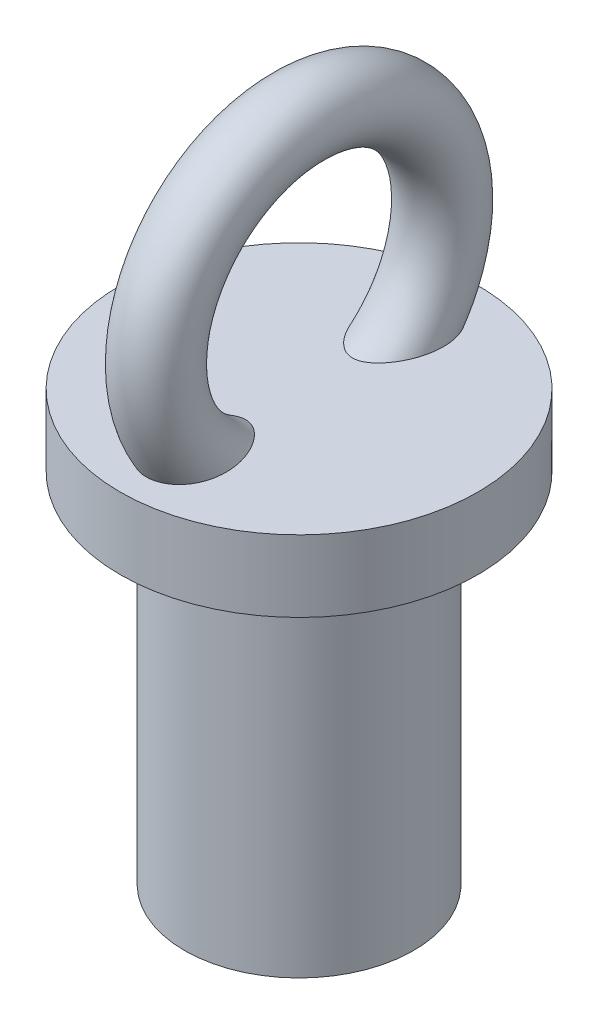
ISO-10303-21;
HEADER;
FILE_DESCRIPTION(('STEP AP214'),'2;1');
FILE_NAME('part.step','',(''),(''),'','','');
FILE_SCHEMA(('AUTOMOTIVE_DESIGN { 1 0 10303 214 1 1 1 1 }'));
ENDSEC;
DATA;
#1=APPLICATION_CONTEXT('core data for automotive mechanical design processes');
#2=APPLICATION_PROTOCOL_DEFINITION('international standard','automotive_design',2000,#1);
#3=PRODUCT_CONTEXT('',#1,'mechanical');
#4=PRODUCT('Part','Part','',(#3));
#5=PRODUCT_RELATED_PRODUCT_CATEGORY('part','',(#4));
#6=PRODUCT_DEFINITION_FORMATION('','',#4);
#7=PRODUCT_DEFINITION_CONTEXT('part definition',#1,'design');
#8=PRODUCT_DEFINITION('design','',#6,#7);
#9=PRODUCT_DEFINITION_SHAPE('','',#8);
#10=(LENGTH_UNIT() NAMED_UNIT(*) SI_UNIT(.MILLI.,.METRE.));
#11=(NAMED_UNIT(*) PLANE_ANGLE_UNIT() SI_UNIT($,.RADIAN.));
#12=(NAMED_UNIT(*) SI_UNIT($,.STERADIAN.) SOLID_ANGLE_UNIT());
#13=UNCERTAINTY_MEASURE_WITH_UNIT(LENGTH_MEASURE(1.E-05),#10,'distance_accuracy_value','');
#14=(GEOMETRIC_REPRESENTATION_CONTEXT(3) GLOBAL_UNCERTAINTY_ASSIGNED_CONTEXT((#13)) GLOBAL_UNIT_ASSIGNED_CONTEXT((#10,
#11,#12)) REPRESENTATION_CONTEXT('',''));
#15=CARTESIAN_POINT('',(0.,0.,0.));
#16=DIRECTION('',(0.,0.,1.));
#17=DIRECTION('',(1.,0.,0.));
#18=AXIS2_PLACEMENT_3D('',#15,#16,#17);
#19=CARTESIAN_POINT('',(0.,30.,0.));
#20=DIRECTION('',(0.,1.,0.));
#21=DIRECTION('',(0.,0.,1.));
#22=AXIS2_PLACEMENT_3D('',#19,#20,#21);
#23=PLANE('',#22);
#24=CARTESIAN_POINT('',(-1.65973719740806,30.,4.87694077281664));
#25=CARTESIAN_POINT('',(-1.61184416152224,30.,4.8060653012158));
#26=CARTESIAN_POINT('',(-1.5618826305594,30.,4.73659977582184));
#27=CARTESIAN_POINT('',(-1.45753858562096,30.,4.60101162825875));
#28=CARTESIAN_POINT('',(-1.40315474072629,30.,4.53489002224317));
#29=CARTESIAN_POINT('',(-1.28977385947139,30.,4.40693799232887));
#30=CARTESIAN_POINT('',(-1.23078634277493,30.,4.34509918744144));
#31=CARTESIAN_POINT('',(-1.10773460767678,30.,4.2267504343605));
#32=CARTESIAN_POINT('',(-1.04367461863202,30.,4.17023613101013));
#33=CARTESIAN_POINT('',(-0.906348389087504,30.,4.0612326432893));
#34=CARTESIAN_POINT('',(-0.832770974201703,30.,4.00912935744943));
#35=CARTESIAN_POINT('',(-0.679154668594548,30.,3.91546596908447));
#36=CARTESIAN_POINT('',(-0.599124774050375,30.,3.8738915110475));
#37=CARTESIAN_POINT('',(-0.446218207178581,30.,3.8104308359769));
#38=CARTESIAN_POINT('',(-0.374219180615295,30.,3.78646815508378));
#39=CARTESIAN_POINT('',(-0.227227377591643,30.,3.75095735399047));
#40=CARTESIAN_POINT('',(-0.152238691776337,30.,3.73939283617331));
#41=CARTESIAN_POINT('',(-0.00105692630563183,30.,3.73006616989524));
#42=CARTESIAN_POINT('',(0.0751399131898369,30.,3.73236278383467));
#43=CARTESIAN_POINT('',(0.225893025875028,30.,3.75058373927254));
#44=CARTESIAN_POINT('',(0.300447703649421,30.,3.76652078150813));
#45=CARTESIAN_POINT('',(0.462032257795318,30.,3.81498995118935));
#46=CARTESIAN_POINT('',(0.548179013834231,30.,3.85041065816256));
#47=CARTESIAN_POINT('',(0.713761051904772,30.,3.93448379263277));
#48=CARTESIAN_POINT('',(0.793180171611948,30.,3.98316696227234));
#49=CARTESIAN_POINT('',(0.931476792947201,30.,4.08043262792541));
#50=CARTESIAN_POINT('',(0.991478068299268,30.,4.12745474625623));
#51=CARTESIAN_POINT('',(1.10722079521999,30.,4.2265180774919));
#52=CARTESIAN_POINT('',(1.16295941159211,30.,4.27856257974739));
#53=CARTESIAN_POINT('',(1.27055008053866,30.,4.38669589943302));
#54=CARTESIAN_POINT('',(1.32239440567098,30.,4.44279234610101));
#55=CARTESIAN_POINT('',(1.42237602359145,30.,4.55820933787256));
#56=CARTESIAN_POINT('',(1.47051200594375,30.,4.61753101017383));
#57=CARTESIAN_POINT('',(1.5954496648629,30.,4.78086835042629));
#58=CARTESIAN_POINT('',(1.66900756421465,30.,4.88737582460946));
#59=CARTESIAN_POINT('',(1.80686857331376,30.,5.10624807590887));
#60=CARTESIAN_POINT('',(1.87116580725034,30.,5.218616510709));
#61=CARTESIAN_POINT('',(1.99081353193913,30.,5.4481134849694));
#62=CARTESIAN_POINT('',(2.0461576695494,30.,5.56524533144457));
#63=CARTESIAN_POINT('',(2.14784654506187,30.,5.80334959162807));
#64=CARTESIAN_POINT('',(2.19419069306517,30.,5.92432225647629));
#65=CARTESIAN_POINT('',(2.2791901888115,30.,6.17394312764173));
#66=CARTESIAN_POINT('',(2.31749961347128,30.,6.30270994412891));
#67=CARTESIAN_POINT('',(2.38374279172641,30.,6.56285676720498));
#68=CARTESIAN_POINT('',(2.4116750536131,30.,6.69423714663383));
#69=CARTESIAN_POINT('',(2.4789129046175,30.,7.09083336709101));
#70=CARTESIAN_POINT('',(2.50188376966707,30.,7.35915271210178));
#71=CARTESIAN_POINT('',(2.49832892006094,30.,7.83432828414623));
#72=CARTESIAN_POINT('',(2.48186767192944,30.,8.04129121130194));
#73=CARTESIAN_POINT('',(2.41593765592417,30.,8.45001574939625));
#74=CARTESIAN_POINT('',(2.36650373032824,30.,8.65178261751603));
#75=CARTESIAN_POINT('',(2.24461524519826,30.,9.00617280498749));
#76=CARTESIAN_POINT('',(2.1782589851733,30.,9.16088889344874));
#77=CARTESIAN_POINT('',(2.02113520800305,30.,9.45744003627901));
#78=CARTESIAN_POINT('',(1.93039339240564,30.,9.59928844340518));
#79=CARTESIAN_POINT('',(1.74077386921208,30.,9.84365714927968));
#80=CARTESIAN_POINT('',(1.64536287223986,30.,9.9488620566535));
#81=CARTESIAN_POINT('',(1.43836540481945,30.,10.1420666568883));
#82=CARTESIAN_POINT('',(1.32678310329686,30.,10.2300707703836));
#83=CARTESIAN_POINT('',(1.08895939554336,30.,10.3853160272703));
#84=CARTESIAN_POINT('',(0.962635827132047,30.,10.4524323282262));
#85=CARTESIAN_POINT('',(0.699525696755851,30.,10.561490208684));
#86=CARTESIAN_POINT('',(0.562745202862769,30.,10.6034462653192));
#87=CARTESIAN_POINT('',(0.298773587740674,30.,10.6566107180067));
#88=CARTESIAN_POINT('',(0.1721497831288,30.,10.670658675406));
#89=CARTESIAN_POINT('',(-0.0815567095035777,30.,10.6760333182587));
#90=CARTESIAN_POINT('',(-0.208639203752063,30.,10.6673686812331));
#91=CARTESIAN_POINT('',(-0.452829601658297,30.,10.6288063193776));
#92=CARTESIAN_POINT('',(-0.570115290682105,30.,10.6000167961122));
#93=CARTESIAN_POINT('',(-0.798401034616843,30.,10.5237209623591));
#94=CARTESIAN_POINT('',(-0.909400868045994,30.,10.4762139928319));
#95=CARTESIAN_POINT('',(-1.12583265898765,30.,10.3627317852323));
#96=CARTESIAN_POINT('',(-1.23099037745777,30.,10.2962359946344));
#97=CARTESIAN_POINT('',(-1.42992439439836,30.,10.1480224991871));
#98=CARTESIAN_POINT('',(-1.52369704306827,30.,10.0662999341411));
#99=CARTESIAN_POINT('',(-1.70722281514738,30.,9.88164735815011));
#100=CARTESIAN_POINT('',(-1.79566746106361,30.,9.77742068387629));
#101=CARTESIAN_POINT('',(-1.95652023463794,30.,9.55730609548703));
#102=CARTESIAN_POINT('',(-2.02892139749143,30.,9.44141314842937));
#103=CARTESIAN_POINT('',(-2.16747627495818,30.,9.18264045452082));
#104=CARTESIAN_POINT('',(-2.23097933496932,30.,9.03834465222771));
#105=CARTESIAN_POINT('',(-2.33727403590676,30.,8.74235856801142));
#106=CARTESIAN_POINT('',(-2.3800505954747,30.,8.59066298981469));
#107=CARTESIAN_POINT('',(-2.46143535461727,30.,8.21121600162146));
#108=CARTESIAN_POINT('',(-2.48877472062232,30.,7.98101941239015));
#109=CARTESIAN_POINT('',(-2.50560853722558,30.,7.51916350125764));
#110=CARTESIAN_POINT('',(-2.49502848969863,30.,7.28750219352624));
#111=CARTESIAN_POINT('',(-2.4397146682966,30.,6.82502370228804));
#112=CARTESIAN_POINT('',(-2.39448753374544,30.,6.59426754496039));
#113=CARTESIAN_POINT('',(-2.2727960545457,30.,6.14153829659001));
#114=CARTESIAN_POINT('',(-2.19637877743403,30.,5.91955252179426));
#115=CARTESIAN_POINT('',(-2.04434967883891,30.,5.55948219796475));
#116=CARTESIAN_POINT('',(-1.97682337434523,30.,5.41792172404782));
#117=CARTESIAN_POINT('',(-1.82843969051971,30.,5.14163500658151));
#118=CARTESIAN_POINT('',(-1.74756669182557,30.,5.00691701512766));
#119=CARTESIAN_POINT('',(-1.65973719740806,30.,4.87694077281664));
#120=B_SPLINE_CURVE_WITH_KNOTS('',3,(#24,#25,#26,#27,#28,#29,#30,#31,#32,#33,#34,#35,#36,#37,
#38,#39,#40,#41,#42,#43,#44,#45,#46,#47,#48,#49,#50,#51,#52,#53,#54,#55,#56,#57,#58,#59,#60,#61,
#62,#63,#64,#65,#66,#67,#68,#69,#70,#71,#72,#73,#74,#75,#76,#77,#78,#79,#80,#81,#82,#83,#84,#85,
#86,#87,#88,#89,#90,#91,#92,#93,#94,#95,#96,#97,#98,#99,#100,#101,#102,#103,#104,#105,#106,#107,
#108,#109,#110,#111,#112,#113,#114,#115,#116,#117,#118,#119),.UNSPECIFIED.,.T.,.F.,(4,2,2,2,2,2,
2,2,2,2,2,2,2,2,2,2,2,2,2,2,2,2,2,2,2,2,2,2,2,2,2,2,2,2,2,2,2,2,2,2,2,2,2,2,2,2,2,4),(0.,
0.256557127233685,0.513191754521179,0.769309089251295,1.02521508116299,1.29503445677581,
1.56448394263497,1.79121236842671,2.01764055539993,2.24502932650449,2.4726300521508,
2.75051735596708,3.02905436026198,3.25743609728915,3.48596843869155,3.7149428923075,
3.94399789212988,4.33173890822469,4.71972486891694,5.10798494917778,5.49627046912927,
5.89885238637069,6.30149215206189,7.10473614504539,7.72538857925908,8.34538620594402,
8.84847839270165,9.35104240294818,9.77535519884023,10.1995588017956,10.6262511457822,
11.0526977360392,11.432926928151,11.8130108719561,12.1736628072752,12.534327442249,
12.90602626267,13.2778439285999,13.6863310469872,14.0949951520909,14.5661842350605,
15.0377156594427,15.7293786390897,16.4224012340741,17.1254799479132,17.8275015794314,
18.297439513377,18.7679313574912),.UNSPECIFIED.);
#121=CARTESIAN_POINT('',(-1.65973719740806,30.,4.87694077281664));
#122=VERTEX_POINT('',#121);
#123=EDGE_CURVE('E64',#122,#122,#120,.T.);
#124=ORIENTED_EDGE('',*,*,#123,.T.);
#125=EDGE_LOOP('',(#124));
#126=FACE_BOUND('',#125,.T.);
#127=CARTESIAN_POINT('',(0.,30.,0.));
#128=DIRECTION('',(0.,1.,0.));
#129=DIRECTION('',(0.,0.,1.));
#130=AXIS2_PLACEMENT_3D('',#127,#128,#129);
#131=CIRCLE('',#130,12.5);
#132=CARTESIAN_POINT('',(0.,30.,12.5));
#133=VERTEX_POINT('',#132);
#134=EDGE_CURVE('E59',#133,#133,#131,.T.);
#135=ORIENTED_EDGE('',*,*,#134,.T.);
#136=EDGE_LOOP('',(#135));
#137=FACE_BOUND('',#136,.T.);
#138=CARTESIAN_POINT('',(-0.758413134255842,30.,-10.5356110981543));
#139=CARTESIAN_POINT('',(-0.644748134894848,30.,-10.578141105606));
#140=CARTESIAN_POINT('',(-0.527577157582067,30.,-10.6113432967939));
#141=CARTESIAN_POINT('',(-0.289303634781813,30.,-10.6575958650521));
#142=CARTESIAN_POINT('',(-0.168201353359479,30.,-10.6706475927782));
#143=CARTESIAN_POINT('',(0.0745287370463819,30.,-10.6759779332172));
#144=CARTESIAN_POINT('',(0.196156798792556,30.,-10.6682450979038));
#145=CARTESIAN_POINT('',(0.436346969263882,30.,-10.6323543877399));
#146=CARTESIAN_POINT('',(0.554908938919432,30.,-10.6041955881001));
#147=CARTESIAN_POINT('',(0.785333938954874,30.,-10.5288857447351));
#148=CARTESIAN_POINT('',(0.897219173265961,30.,-10.4818022060518));
#149=CARTESIAN_POINT('',(1.11215196896264,30.,-10.3706245084405));
#150=CARTESIAN_POINT('',(1.21519802170283,30.,-10.3065274533093));
#151=CARTESIAN_POINT('',(1.41688751796292,30.,-10.1590542931787));
#152=CARTESIAN_POINT('',(1.51481073253747,30.,-10.0746966664985));
#153=CARTESIAN_POINT('',(1.69703348541009,30.,-9.8924133132446));
#154=CARTESIAN_POINT('',(1.78132751114692,30.,-9.79448212620444));
#155=CARTESIAN_POINT('',(1.94534571465823,30.,-9.57492252191879));
#156=CARTESIAN_POINT('',(2.02314935329344,30.,-9.45186326179041));
#157=CARTESIAN_POINT('',(2.16049652695256,30.,-9.19599955458119));
#158=CARTESIAN_POINT('',(2.22003107398795,30.,-9.06319035043291));
#159=CARTESIAN_POINT('',(2.33021225062337,30.,-8.76719936910982));
#160=CARTESIAN_POINT('',(2.37748756363321,30.,-8.60276571526227));
#161=CARTESIAN_POINT('',(2.44900727659294,30.,-8.26900662089087));
#162=CARTESIAN_POINT('',(2.4732344584595,30.,-8.09967762044947));
#163=CARTESIAN_POINT('',(2.50693904473397,30.,-7.6769741577271));
#164=CARTESIAN_POINT('',(2.50361856078696,30.,-7.42255383168002));
#165=CARTESIAN_POINT('',(2.45559125952516,30.,-6.91738347695858));
#166=CARTESIAN_POINT('',(2.41079542153266,30.,-6.66664252186284));
#167=CARTESIAN_POINT('',(2.31551805019501,30.,-6.29626266506913));
#168=CARTESIAN_POINT('',(2.27872342744508,30.,-6.17292412309867));
#169=CARTESIAN_POINT('',(2.19601898355354,30.,-5.92935167407365));
#170=CARTESIAN_POINT('',(2.15011168436136,30.,-5.8091169184212));
#171=CARTESIAN_POINT('',(2.04946343909705,30.,-5.57254728455121));
#172=CARTESIAN_POINT('',(1.99473164106455,30.,-5.45620851673867));
#173=CARTESIAN_POINT('',(1.87643219327263,30.,-5.22818178558024));
#174=CARTESIAN_POINT('',(1.812868181802,30.,-5.11649193168379));
#175=CARTESIAN_POINT('',(1.66173919657813,30.,-4.87503472931957));
#176=CARTESIAN_POINT('',(1.57196114199668,30.,-4.74662043598736));
#177=CARTESIAN_POINT('',(1.42621614632237,30.,-4.56286054711328));
#178=CARTESIAN_POINT('',(1.37579101257971,30.,-4.5030869949155));
#179=CARTESIAN_POINT('',(1.27095964864124,30.,-4.38715008656172));
#180=CARTESIAN_POINT('',(1.21655455474005,30.,-4.33098570850757));
#181=CARTESIAN_POINT('',(1.07984761043584,30.,-4.20062548335605));
#182=CARTESIAN_POINT('',(0.99536798378748,30.,-4.12866818080871));
#183=CARTESIAN_POINT('',(0.81687441594671,30.,-3.99766632695331));
#184=CARTESIAN_POINT('',(0.722880120362374,30.,-3.93859593235942));
#185=CARTESIAN_POINT('',(0.554330294344375,30.,-3.85392951098189));
#186=CARTESIAN_POINT('',(0.48218578133529,30.,-3.82359788232223));
#187=CARTESIAN_POINT('',(0.333949544633765,30.,-3.77498845787746));
#188=CARTESIAN_POINT('',(0.25786431534191,30.,-3.7566914702833));
#189=CARTESIAN_POINT('',(0.102965193962144,30.,-3.73420771793028));
#190=CARTESIAN_POINT('',(0.0241348389722406,30.,-3.73013034779506));
#191=CARTESIAN_POINT('',(-0.132876203423331,30.,-3.73698266985317));
#192=CARTESIAN_POINT('',(-0.211056576474716,30.,-3.74791924176632));
#193=CARTESIAN_POINT('',(-0.372086668741304,30.,-3.78513629212785));
#194=CARTESIAN_POINT('',(-0.454589761448696,30.,-3.81287905057806));
#195=CARTESIAN_POINT('',(-0.614002545314922,30.,-3.88136217889199));
#196=CARTESIAN_POINT('',(-0.690900434453883,30.,-3.92212905300212));
#197=CARTESIAN_POINT('',(-0.880921073261122,30.,-4.03935617045872));
#198=CARTESIAN_POINT('',(-0.989619713799763,30.,-4.12289792864272));
#199=CARTESIAN_POINT('',(-1.19360240789678,30.,-4.30497269227865));
#200=CARTESIAN_POINT('',(-1.28884634483405,30.,-4.40354877970185));
#201=CARTESIAN_POINT('',(-1.45611113621868,30.,-4.59763432644989));
#202=CARTESIAN_POINT('',(-1.52954514188674,30.,-4.69194352272404));
#203=CARTESIAN_POINT('',(-1.66818633072238,30.,-4.88648503069481));
#204=CARTESIAN_POINT('',(-1.73338772243841,30.,-4.98672144006164));
#205=CARTESIAN_POINT('',(-1.85600695392776,30.,-5.19193025141808));
#206=CARTESIAN_POINT('',(-1.91341874234339,30.,-5.29690625194451));
#207=CARTESIAN_POINT('',(-2.02058223206915,30.,-5.51070106734257));
#208=CARTESIAN_POINT('',(-2.07033295859304,30.,-5.6195203690702));
#209=CARTESIAN_POINT('',(-2.16474954006325,30.,-5.846643818132));
#210=CARTESIAN_POINT('',(-2.20896581379904,30.,-5.9651355597392));
#211=CARTESIAN_POINT('',(-2.28856486514876,30.,-6.20502834764283));
#212=CARTESIAN_POINT('',(-2.32394659419787,30.,-6.32642973741064));
#213=CARTESIAN_POINT('',(-2.41620687696214,30.,-6.69388171680005));
#214=CARTESIAN_POINT('',(-2.45937478198948,30.,-6.94359756523508));
#215=CARTESIAN_POINT('',(-2.50188816833363,30.,-7.41768999444522));
#216=CARTESIAN_POINT('',(-2.50571207870856,30.,-7.64166884610907));
#217=CARTESIAN_POINT('',(-2.47721673834014,30.,-8.08746105362172));
#218=CARTESIAN_POINT('',(-2.4449317178553,30.,-8.30927625962341));
#219=CARTESIAN_POINT('',(-2.35106497505074,30.,-8.69918495635421));
#220=CARTESIAN_POINT('',(-2.29677669880118,30.,-8.86902962222905));
#221=CARTESIAN_POINT('',(-2.16129666292553,30.,-9.19770423937486));
#222=CARTESIAN_POINT('',(-2.08013244638306,30.,-9.3565452667382));
#223=CARTESIAN_POINT('',(-1.90621315134097,30.,-9.63191042813459));
#224=CARTESIAN_POINT('',(-1.81764529865881,30.,-9.75107489201086));
#225=CARTESIAN_POINT('',(-1.62202854772921,30.,-9.97316010001746));
#226=CARTESIAN_POINT('',(-1.51499795481011,30.,-10.0760967419545));
#227=CARTESIAN_POINT('',(-1.3031552764971,30.,-10.2460280903349));
#228=CARTESIAN_POINT('',(-1.20084755931528,30.,-10.3161479840294));
#229=CARTESIAN_POINT('',(-0.986374651835045,30.,-10.4392716488404));
#230=CARTESIAN_POINT('',(-0.874213361371323,30.,-10.4922821530102));
#231=CARTESIAN_POINT('',(-0.758413134255842,30.,-10.5356110981543));
#232=B_SPLINE_CURVE_WITH_KNOTS('',3,(#138,#139,#140,#141,#142,#143,#144,#145,#146,#147,#148,
#149,#150,#151,#152,#153,#154,#155,#156,#157,#158,#159,#160,#161,#162,#163,#164,#165,#166,#167,
#168,#169,#170,#171,#172,#173,#174,#175,#176,#177,#178,#179,#180,#181,#182,#183,#184,#185,#186,
#187,#188,#189,#190,#191,#192,#193,#194,#195,#196,#197,#198,#199,#200,#201,#202,#203,#204,#205,
#206,#207,#208,#209,#210,#211,#212,#213,#214,#215,#216,#217,#218,#219,#220,#221,#222,#223,#224,
#225,#226,#227,#228,#229,#230,#231),.UNSPECIFIED.,.T.,.F.,(4,2,2,2,2,2,2,2,2,2,2,2,2,2,2,2,2,2,
2,2,2,2,2,2,2,2,2,2,2,2,2,2,2,2,2,2,2,2,2,2,2,2,2,2,2,2,4),(0.,0.363671369817673,
0.727318362220879,1.09116569048229,1.4550294930268,1.8176067416285,2.18024575122042,
2.56642958972152,2.95276923831707,3.38788468728865,3.82321386148895,4.33461846642386,
4.84640481634487,5.60567643672672,6.36658150799068,6.75241717246001,7.13814620472296,
7.52347790669139,7.90865134543942,8.37761619119064,8.61207473119511,8.84646659164454,
9.17852903074332,9.50991930559087,9.74386675086721,9.9774402064864,10.2128066770715,
10.4482810337773,10.7079711877011,10.9681932172899,11.3771866342295,11.7873748714283,
12.1454731025138,12.5038218601955,12.8624474265885,13.2211185865208,13.6001707099508,
13.9792678014018,14.7361176974556,15.4057121499584,16.0746723832183,16.6075847842601,
17.1399527259687,17.5835809146337,18.0267717593341,18.3974208339712,18.7679238688283),.UNSPECIFIED.);
#233=CARTESIAN_POINT('',(-0.758413134255842,30.,-10.5356110981543));
#234=VERTEX_POINT('',#233);
#235=EDGE_CURVE('E42',#234,#234,#232,.T.);
#236=ORIENTED_EDGE('',*,*,#235,.T.);
#237=EDGE_LOOP('',(#236));
#238=FACE_BOUND('',#237,.T.);
#239=ADVANCED_FACE('F38',(#126,#137,#238),#23,.T.);
#240=CARTESIAN_POINT('',(0.,24.9999999999999,0.));
#241=DIRECTION('',(0.,-1.,0.));
#242=DIRECTION('',(0.,0.,-1.));
#243=AXIS2_PLACEMENT_3D('',#240,#241,#242);
#244=CYLINDRICAL_SURFACE('',#243,8.);
#245=CARTESIAN_POINT('',(0.,24.9999999999999,0.));
#246=DIRECTION('',(0.,1.,0.));
#247=DIRECTION('',(0.,0.,1.));
#248=AXIS2_PLACEMENT_3D('',#245,#246,#247);
#249=CIRCLE('',#248,8.);
#250=CARTESIAN_POINT('',(0.,24.9999999999999,8.00000000000003));
#251=VERTEX_POINT('',#250);
#252=EDGE_CURVE('E10',#251,#251,#249,.T.);
#253=ORIENTED_EDGE('',*,*,#252,.F.);
#254=EDGE_LOOP('',(#253));
#255=FACE_BOUND('',#254,.T.);
#256=CARTESIAN_POINT('',(0.,0.,0.));
#257=DIRECTION('',(0.,1.,0.));
#258=DIRECTION('',(0.,0.,1.));
#259=AXIS2_PLACEMENT_3D('',#256,#257,#258);
#260=CIRCLE('',#259,8.);
#261=CARTESIAN_POINT('',(0.,0.,8.00000000000003));
#262=VERTEX_POINT('',#261);
#263=EDGE_CURVE('E52',#262,#262,#260,.T.);
#264=ORIENTED_EDGE('',*,*,#263,.T.);
#265=EDGE_LOOP('',(#264));
#266=FACE_BOUND('',#265,.T.);
#267=ADVANCED_FACE('F40',(#255,#266),#244,.T.);
#268=CARTESIAN_POINT('',(0.,0.,0.));
#269=DIRECTION('',(0.,1.,0.));
#270=DIRECTION('',(0.,0.,1.));
#271=AXIS2_PLACEMENT_3D('',#268,#269,#270);
#272=PLANE('',#271);
#273=ORIENTED_EDGE('',*,*,#263,.F.);
#274=EDGE_LOOP('',(#273));
#275=FACE_BOUND('',#274,.T.);
#276=ADVANCED_FACE('F89',(#275),#272,.F.);
#277=CARTESIAN_POINT('',(0.,30.,0.));
#278=DIRECTION('',(0.,-1.,0.));
#279=DIRECTION('',(0.,0.,-1.));
#280=AXIS2_PLACEMENT_3D('',#277,#278,#279);
#281=CYLINDRICAL_SURFACE('',#280,12.5);
#282=ORIENTED_EDGE('',*,*,#134,.F.);
#283=EDGE_LOOP('',(#282));
#284=FACE_BOUND('',#283,.T.);
#285=CARTESIAN_POINT('',(0.,24.9999999999999,0.));
#286=DIRECTION('',(0.,1.,0.));
#287=DIRECTION('',(0.,0.,1.));
#288=AXIS2_PLACEMENT_3D('',#285,#286,#287);
#289=CIRCLE('',#288,12.5);
#290=CARTESIAN_POINT('',(0.,24.9999999999999,12.5));
#291=VERTEX_POINT('',#290);
#292=EDGE_CURVE('E62',#291,#291,#289,.T.);
#293=ORIENTED_EDGE('',*,*,#292,.T.);
#294=EDGE_LOOP('',(#293));
#295=FACE_BOUND('',#294,.T.);
#296=ADVANCED_FACE('F81',(#284,#295),#281,.T.);
#297=CARTESIAN_POINT('',(0.,24.9999999999999,0.));
#298=DIRECTION('',(0.,1.,0.));
#299=DIRECTION('',(0.,0.,1.));
#300=AXIS2_PLACEMENT_3D('',#297,#298,#299);
#301=PLANE('',#300);
#302=ORIENTED_EDGE('',*,*,#252,.T.);
#303=EDGE_LOOP('',(#302));
#304=FACE_BOUND('',#303,.T.);
#305=ORIENTED_EDGE('',*,*,#292,.F.);
#306=EDGE_LOOP('',(#305));
#307=FACE_BOUND('',#306,.T.);
#308=ADVANCED_FACE('F75',(#304,#307),#301,.F.);
#309=CARTESIAN_POINT('',(0.,36.5053382464098,0.));
#310=DIRECTION('',(-1.,0.,0.));
#311=DIRECTION('',(0.,0.,1.));
#312=AXIS2_PLACEMENT_3D('',#309,#310,#311);
#313=TOROIDAL_SURFACE('',#312,9.99999999999999,2.5);
#314=ORIENTED_EDGE('',*,*,#235,.F.);
#315=EDGE_LOOP('',(#314));
#316=FACE_BOUND('',#315,.T.);
#317=ORIENTED_EDGE('',*,*,#123,.F.);
#318=EDGE_LOOP('',(#317));
#319=FACE_BOUND('',#318,.T.);
#320=ADVANCED_FACE('F72',(#316,#319),#313,.T.);
#321=CLOSED_SHELL('',(#239,#267,#276,#296,#308,#320));
#322=MANIFOLD_SOLID_BREP('B2',#321);
#323=ADVANCED_BREP_SHAPE_REPRESENTATION('',(#18,#322),#14);
#324=SHAPE_DEFINITION_REPRESENTATION(#9,#323);
ENDSEC;
END-ISO-10303-21;
